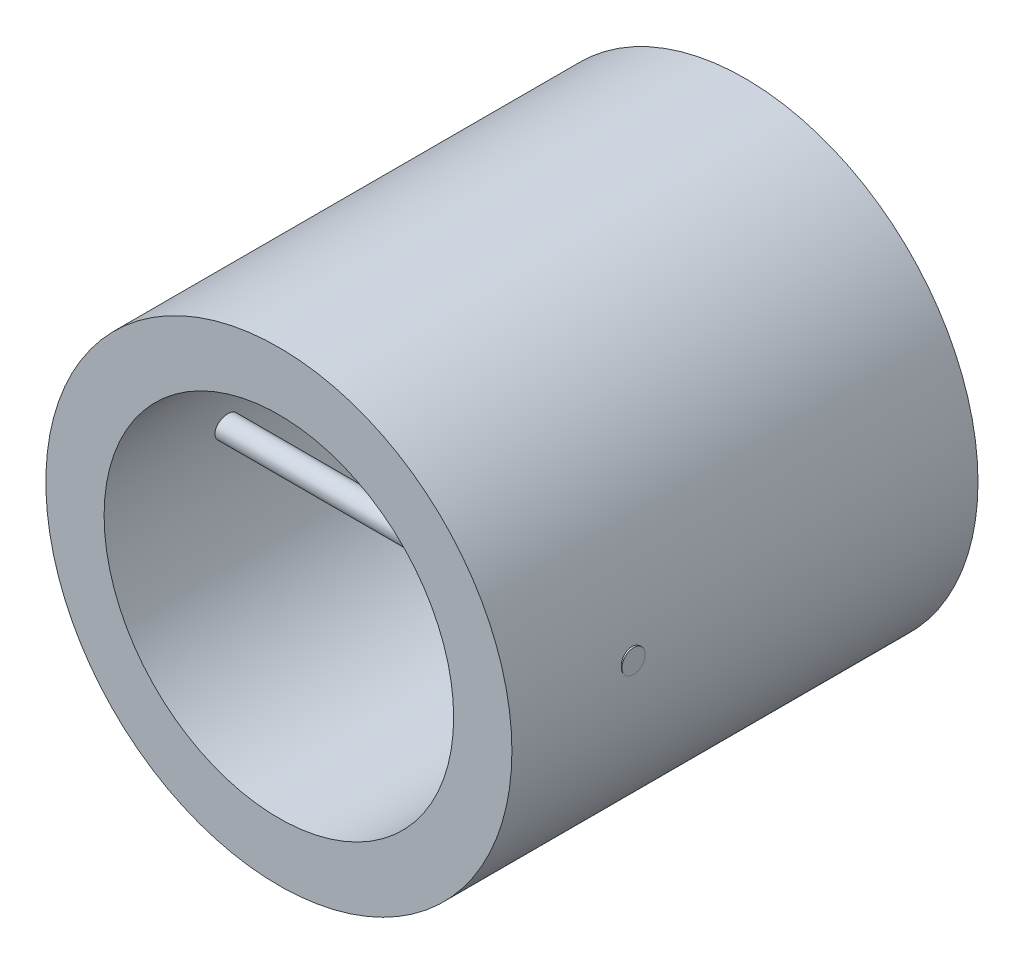
ISO-10303-21;
HEADER;
FILE_DESCRIPTION(('STEP AP214'),'2;1');
FILE_NAME('part.step','',(''),(''),'','','');
FILE_SCHEMA(('AUTOMOTIVE_DESIGN { 1 0 10303 214 1 1 1 1 }'));
ENDSEC;
DATA;
#1=APPLICATION_CONTEXT('core data for automotive mechanical design processes');
#2=APPLICATION_PROTOCOL_DEFINITION('international standard','automotive_design',2000,#1);
#3=PRODUCT_CONTEXT('',#1,'mechanical');
#4=PRODUCT('Part','Part','',(#3));
#5=PRODUCT_RELATED_PRODUCT_CATEGORY('part','',(#4));
#6=PRODUCT_DEFINITION_FORMATION('','',#4);
#7=PRODUCT_DEFINITION_CONTEXT('part definition',#1,'design');
#8=PRODUCT_DEFINITION('design','',#6,#7);
#9=PRODUCT_DEFINITION_SHAPE('','',#8);
#10=(LENGTH_UNIT() NAMED_UNIT(*) SI_UNIT(.MILLI.,.METRE.));
#11=(NAMED_UNIT(*) PLANE_ANGLE_UNIT() SI_UNIT($,.RADIAN.));
#12=(NAMED_UNIT(*) SI_UNIT($,.STERADIAN.) SOLID_ANGLE_UNIT());
#13=UNCERTAINTY_MEASURE_WITH_UNIT(LENGTH_MEASURE(1.E-05),#10,'distance_accuracy_value','');
#14=(GEOMETRIC_REPRESENTATION_CONTEXT(3) GLOBAL_UNCERTAINTY_ASSIGNED_CONTEXT((#13)) GLOBAL_UNIT_ASSIGNED_CONTEXT((#10,
#11,#12)) REPRESENTATION_CONTEXT('',''));
#15=CARTESIAN_POINT('',(0.,0.,0.));
#16=DIRECTION('',(0.,0.,1.));
#17=DIRECTION('',(1.,0.,0.));
#18=AXIS2_PLACEMENT_3D('',#15,#16,#17);
#19=CARTESIAN_POINT('',(0.,0.,-20.));
#20=DIRECTION('',(0.,0.,1.));
#21=DIRECTION('',(1.,0.,0.));
#22=AXIS2_PLACEMENT_3D('',#19,#20,#21);
#23=CYLINDRICAL_SURFACE('',#22,20.);
#24=CARTESIAN_POINT('',(-19.9465515347339,1.46119193544392,10.5588854534509));
#25=CARTESIAN_POINT('',(-19.9506619454008,1.4050766842799,10.5588830165754));
#26=CARTESIAN_POINT('',(-19.9545365537507,1.34890495652887,10.5541465271091));
#27=CARTESIAN_POINT('',(-19.9617200771043,1.23807331930656,10.5352995807464));
#28=CARTESIAN_POINT('',(-19.9650283446956,1.18341519913556,10.5211784846462));
#29=CARTESIAN_POINT('',(-19.9710389955557,1.07723191949604,10.4839462502608));
#30=CARTESIAN_POINT('',(-19.973741591046,1.02570566727827,10.4608382686794));
#31=CARTESIAN_POINT('',(-19.9785539700852,0.927261151305984,10.4062841119598));
#32=CARTESIAN_POINT('',(-19.9806638943725,0.880341795301941,10.3748399198281));
#33=CARTESIAN_POINT('',(-19.9843402566161,0.792513011556447,10.3045574234109));
#34=CARTESIAN_POINT('',(-19.9859075611722,0.751594061589184,10.265731064039));
#35=CARTESIAN_POINT('',(-19.9885787978779,0.676845763661389,10.1817507845756));
#36=CARTESIAN_POINT('',(-19.9896827145537,0.643016652467685,10.1365966532507));
#37=CARTESIAN_POINT('',(-19.9915105715711,0.583434901213421,10.0412749925837));
#38=CARTESIAN_POINT('',(-19.9922347515128,0.557677172542575,9.99111064835176));
#39=CARTESIAN_POINT('',(-19.9933812466742,0.514942633891496,9.88716857925103));
#40=CARTESIAN_POINT('',(-19.9938035622836,0.497965812573834,9.83339085904779));
#41=CARTESIAN_POINT('',(-19.9944033709984,0.473273736454219,9.72373848395316));
#42=CARTESIAN_POINT('',(-19.9945808214333,0.465560095893822,9.66786346532661));
#43=CARTESIAN_POINT('',(-19.9947182916794,0.459619047251709,9.55561115713792));
#44=CARTESIAN_POINT('',(-19.9946783116342,0.46139163290258,9.49923386790766));
#45=CARTESIAN_POINT('',(-19.9943744847288,0.474373534997462,9.38756922955763));
#46=CARTESIAN_POINT('',(-19.9941106073618,0.485584137400545,9.3322820300166));
#47=CARTESIAN_POINT('',(-19.9933195990725,0.517124938020043,9.2243750919469));
#48=CARTESIAN_POINT('',(-19.9927924679505,0.537455143157896,9.17175535544275));
#49=CARTESIAN_POINT('',(-19.9914091218533,0.586654827576998,9.07068076976584));
#50=CARTESIAN_POINT('',(-19.9905529269851,0.615523785083075,9.02222566633942));
#51=CARTESIAN_POINT('',(-19.9884300819366,0.68097826876219,8.93085287044461));
#52=CARTESIAN_POINT('',(-19.9871634331897,0.717563767985105,8.88793515863766));
#53=CARTESIAN_POINT('',(-19.9841374080744,0.797397967138272,8.80886321794997));
#54=CARTESIAN_POINT('',(-19.982378137207,0.840645239476871,8.7727075436582));
#55=CARTESIAN_POINT('',(-19.9782987679457,0.932572537246193,8.70817079254074));
#56=CARTESIAN_POINT('',(-19.975978671187,0.981252546836091,8.67978969304671));
#57=CARTESIAN_POINT('',(-19.970739012161,1.08266274357957,8.63159484974914));
#58=CARTESIAN_POINT('',(-19.9678193537935,1.13539357916724,8.61178248096055));
#59=CARTESIAN_POINT('',(-19.9613850255148,1.24339553207687,8.58127942526351));
#60=CARTESIAN_POINT('',(-19.9578703515743,1.29866666659903,8.57058880012738));
#61=CARTESIAN_POINT('',(-19.9502946746519,1.4102748693819,8.55860412779387));
#62=CARTESIAN_POINT('',(-19.9462327699023,1.46661356228753,8.55732578858436));
#63=CARTESIAN_POINT('',(-19.9376764375796,1.57867564062663,8.56422512057954));
#64=CARTESIAN_POINT('',(-19.9331820008858,1.63439901305751,8.57240299122239));
#65=CARTESIAN_POINT('',(-19.923905751495,1.74384845303163,8.59801370622493));
#66=CARTESIAN_POINT('',(-19.9191230343683,1.79756727641313,8.6154771826987));
#67=CARTESIAN_POINT('',(-19.9094893411738,1.90130231300925,8.65917953107272));
#68=CARTESIAN_POINT('',(-19.9046383636652,1.95131844792384,8.6854185884838));
#69=CARTESIAN_POINT('',(-19.8950922585191,2.04636118309854,8.74601337038325));
#70=CARTESIAN_POINT('',(-19.8903975513616,2.09137498130634,8.78038924634217));
#71=CARTESIAN_POINT('',(-19.8814284427883,2.17498846933629,8.85626083861334));
#72=CARTESIAN_POINT('',(-19.8771540397907,2.21358818329843,8.8977565281283));
#73=CARTESIAN_POINT('',(-19.8692783439921,2.28320097696869,8.98662555329525));
#74=CARTESIAN_POINT('',(-19.8656758834042,2.31422724829828,9.03398844913109));
#75=CARTESIAN_POINT('',(-19.8593531353769,2.36787371822895,9.13331113082876));
#76=CARTESIAN_POINT('',(-19.8566328147005,2.39049423354483,9.18527074340265));
#77=CARTESIAN_POINT('',(-19.8522593566153,2.42654661231349,9.29197298543298));
#78=CARTESIAN_POINT('',(-19.8505997889615,2.44003387145038,9.3466966334978));
#79=CARTESIAN_POINT('',(-19.8484279067266,2.45763904768864,9.45765255131053));
#80=CARTESIAN_POINT('',(-19.8479155498389,2.46175731029779,9.5138847653485));
#81=CARTESIAN_POINT('',(-19.8480707931089,2.46050520446628,9.62592042785481));
#82=CARTESIAN_POINT('',(-19.8487316978564,2.45518867726314,9.68172449577131));
#83=CARTESIAN_POINT('',(-19.8511780036104,2.43532966951467,9.7916398374105));
#84=CARTESIAN_POINT('',(-19.8529634009289,2.42078721922686,9.84575111668429));
#85=CARTESIAN_POINT('',(-19.8575458179143,2.38290485876868,9.9507534860569));
#86=CARTESIAN_POINT('',(-19.8603428321724,2.35956499563564,10.0016445933714));
#87=CARTESIAN_POINT('',(-19.8667766688428,2.30476519820675,10.0987875002795));
#88=CARTESIAN_POINT('',(-19.870413484349,2.27330533068534,10.1450393380196));
#89=CARTESIAN_POINT('',(-19.8783348318486,2.20296625347754,10.2318713826887));
#90=CARTESIAN_POINT('',(-19.8826228338342,2.16404698461762,10.2724188178245));
#91=CARTESIAN_POINT('',(-19.8915916399326,2.07999153933606,10.3464280292331));
#92=CARTESIAN_POINT('',(-19.8962725525546,2.03485364331015,10.3798878390854));
#93=CARTESIAN_POINT('',(-19.9058120209463,1.93932094803563,10.4389816638587));
#94=CARTESIAN_POINT('',(-19.9106715469772,1.88889335032583,10.4645624484229));
#95=CARTESIAN_POINT('',(-19.9202998762838,1.78448595291054,10.5068551001982));
#96=CARTESIAN_POINT('',(-19.9250687778475,1.73051032261434,10.5235771753089));
#97=CARTESIAN_POINT('',(-19.9326471902087,1.64037452545924,10.5433613849527));
#98=CARTESIAN_POINT('',(-19.9355436327302,1.60480173323676,10.5491743543593));
#99=CARTESIAN_POINT('',(-19.9411762950443,1.53322436638089,10.5569371745659));
#100=CARTESIAN_POINT('',(-19.9439125145316,1.49721979092499,10.5588870180059));
#101=CARTESIAN_POINT('',(-19.9465515347339,1.46119193544392,10.5588854534509));
#102=B_SPLINE_CURVE_WITH_KNOTS('',3,(#24,#25,#26,#27,#28,#29,#30,#31,#32,#33,#34,#35,#36,#37,
#38,#39,#40,#41,#42,#43,#44,#45,#46,#47,#48,#49,#50,#51,#52,#53,#54,#55,#56,#57,#58,#59,#60,#61,
#62,#63,#64,#65,#66,#67,#68,#69,#70,#71,#72,#73,#74,#75,#76,#77,#78,#79,#80,#81,#82,#83,#84,#85,
#86,#87,#88,#89,#90,#91,#92,#93,#94,#95,#96,#97,#98,#99,#100,#101),.UNSPECIFIED.,.T.,.F.,(4,2,2,
2,2,2,2,2,2,2,2,2,2,2,2,2,2,2,2,2,2,2,2,2,2,2,2,2,2,2,2,2,2,2,2,2,2,2,4),(0.,0.168665581104644,
0.337522703070151,0.506320566335337,0.675078312167977,0.843565283718895,1.01205788103543,
1.18044403732479,1.34882997620257,1.5172452544791,1.68566042148606,1.85409853929669,
2.02253678494581,2.19096474001148,2.35939210685003,2.5277834304532,2.69617426307229,
2.86459210716925,3.03301109178028,3.20171108411023,3.37041463450729,3.53967820260071,
3.70894534905644,3.87863616780479,4.04832634789135,4.21771881357034,4.38710489617766,
4.55545417682229,4.72379724901846,4.89118272976934,5.05856766156247,5.22595169840742,
5.39333435882202,5.56164246267165,5.7299972016426,5.89946557832908,6.06873824932939,
6.17702694941225,6.28531585580788),.UNSPECIFIED.);
#103=CARTESIAN_POINT('',(-19.9465515347339,1.46119193544392,10.5588854534509));
#104=VERTEX_POINT('',#103);
#105=EDGE_CURVE('E80',#104,#104,#102,.T.);
#106=ORIENTED_EDGE('',*,*,#105,.T.);
#107=EDGE_LOOP('',(#106));
#108=FACE_BOUND('',#107,.T.);
#109=CARTESIAN_POINT('',(0.,0.,-20.));
#110=DIRECTION('',(0.,0.,1.));
#111=DIRECTION('',(1.,0.,0.));
#112=AXIS2_PLACEMENT_3D('',#109,#110,#111);
#113=CIRCLE('',#112,20.);
#114=CARTESIAN_POINT('',(20.,0.,-20.));
#115=VERTEX_POINT('',#114);
#116=EDGE_CURVE('E51',#115,#115,#113,.T.);
#117=ORIENTED_EDGE('',*,*,#116,.T.);
#118=EDGE_LOOP('',(#117));
#119=FACE_BOUND('',#118,.T.);
#120=CARTESIAN_POINT('',(0.,0.,20.));
#121=DIRECTION('',(0.,0.,1.));
#122=DIRECTION('',(1.,0.,0.));
#123=AXIS2_PLACEMENT_3D('',#120,#121,#122);
#124=CIRCLE('',#123,20.);
#125=CARTESIAN_POINT('',(20.,0.,20.));
#126=VERTEX_POINT('',#125);
#127=EDGE_CURVE('E97',#126,#126,#124,.T.);
#128=ORIENTED_EDGE('',*,*,#127,.F.);
#129=EDGE_LOOP('',(#128));
#130=FACE_BOUND('',#129,.T.);
#131=CARTESIAN_POINT('',(19.9465515347339,1.46119193544392,10.5588854534509));
#132=CARTESIAN_POINT('',(19.9424215131454,1.51756565999967,10.5588829627177));
#133=CARTESIAN_POINT('',(19.9380476372395,1.57396242114039,10.5541025562396));
#134=CARTESIAN_POINT('',(19.9289572840547,1.68516608636732,10.5351152972267));
#135=CARTESIAN_POINT('',(19.9242403946397,1.73997096338645,10.5208969324661));
#136=CARTESIAN_POINT('',(19.9146623891275,1.8463676968716,10.4834486589411));
#137=CARTESIAN_POINT('',(19.9098013546762,1.8979613227866,10.4602237648523));
#138=CARTESIAN_POINT('',(19.9001622768126,1.9964957199662,10.4054240680568));
#139=CARTESIAN_POINT('',(19.8953842134354,2.04343762371206,10.3738513045739));
#140=CARTESIAN_POINT('',(19.886153061483,2.13140273890986,10.3031991600586));
#141=CARTESIAN_POINT('',(19.8817003101653,2.17241984986541,10.2641121370693));
#142=CARTESIAN_POINT('',(19.8733754018801,2.24730357288132,10.1795449890972));
#143=CARTESIAN_POINT('',(19.8695032588316,2.28117001352593,10.1340647108989));
#144=CARTESIAN_POINT('',(19.862582818818,2.34066251315832,10.0381607015149));
#145=CARTESIAN_POINT('',(19.8595317405092,2.3663164493399,9.98775446874156));
#146=CARTESIAN_POINT('',(19.8544255176074,2.40878552909334,9.8832996611274));
#147=CARTESIAN_POINT('',(19.8523703293431,2.42560106024595,9.82925124612039));
#148=CARTESIAN_POINT('',(19.8493974961035,2.44980984763294,9.71943210245739));
#149=CARTESIAN_POINT('',(19.8484723649826,2.45726512084882,9.66367524454637));
#150=CARTESIAN_POINT('',(19.8477943274435,2.46273596552048,9.55169412764084));
#151=CARTESIAN_POINT('',(19.848041383069,2.46075184263015,9.49546988383945));
#152=CARTESIAN_POINT('',(19.8496880840853,2.44743266523838,9.38440212526531));
#153=CARTESIAN_POINT('',(19.8510828155368,2.43613747703487,9.32955374937227));
#154=CARTESIAN_POINT('',(19.8549298422451,2.40458135644365,9.22253971295153));
#155=CARTESIAN_POINT('',(19.8573821468081,2.38432034516059,9.17037407603527));
#156=CARTESIAN_POINT('',(19.8631983809318,2.33537059060593,9.07007857115747));
#157=CARTESIAN_POINT('',(19.8665642318001,2.30666407452679,9.0219574919876));
#158=CARTESIAN_POINT('',(19.8740033545335,2.24166396098732,8.93120808539756));
#159=CARTESIAN_POINT('',(19.8780766514423,2.20537009492489,8.88857995252125));
#160=CARTESIAN_POINT('',(19.8867263796979,2.12596225344342,8.80973179090466));
#161=CARTESIAN_POINT('',(19.8913058969164,2.08280565564946,8.77355502410482));
#162=CARTESIAN_POINT('',(19.9006986468477,1.9910591420776,8.70895086600609));
#163=CARTESIAN_POINT('',(19.9055118869313,1.94246905488418,8.68052371928925));
#164=CARTESIAN_POINT('',(19.9151575105533,1.84095383604226,8.63208462255368));
#165=CARTESIAN_POINT('',(19.9199898661959,1.78800781663877,8.61211642661418));
#166=CARTESIAN_POINT('',(19.9294323635215,1.6794909876885,8.58137547002366));
#167=CARTESIAN_POINT('',(19.9340425043237,1.62392016774048,8.57060274581461));
#168=CARTESIAN_POINT('',(19.9428658115035,1.51171105592774,8.55856926570932));
#169=CARTESIAN_POINT('',(19.9470788725415,1.45507248555957,8.55731102689394));
#170=CARTESIAN_POINT('',(19.9549810350418,1.34235760858922,8.56436705809683));
#171=CARTESIAN_POINT('',(19.9586701451746,1.28628129269691,8.57268116968732));
#172=CARTESIAN_POINT('',(19.9654433888407,1.1764729664424,8.59862097276451));
#173=CARTESIAN_POINT('',(19.9685293764109,1.12273417941964,8.61621749223268));
#174=CARTESIAN_POINT('',(19.9740939160225,1.01895779644117,8.66021689869922));
#175=CARTESIAN_POINT('',(19.9765724780122,0.968920139879481,8.68661964145673));
#176=CARTESIAN_POINT('',(19.9809446758823,0.874127036467802,8.74739584168316));
#177=CARTESIAN_POINT('',(19.9828400185041,0.829356418250767,8.78174551617164));
#178=CARTESIAN_POINT('',(19.986117868307,0.746208700860536,8.85748582417677));
#179=CARTESIAN_POINT('',(19.987500378538,0.707831563663657,8.8988764158163));
#180=CARTESIAN_POINT('',(19.9898319680273,0.638607608891307,8.98747323434959));
#181=CARTESIAN_POINT('',(19.9907815253065,0.607752503888329,9.03467297388817));
#182=CARTESIAN_POINT('',(19.9923325129868,0.554397144194585,9.13358464671038));
#183=CARTESIAN_POINT('',(19.9929339437765,0.531896880174795,9.18529657495564));
#184=CARTESIAN_POINT('',(19.9938595335276,0.495890745591106,9.2917676377558));
#185=CARTESIAN_POINT('',(19.9941836777263,0.482385353922169,9.34652693438715));
#186=CARTESIAN_POINT('',(19.9946013177639,0.464754862350147,9.45753629823623));
#187=CARTESIAN_POINT('',(19.9946948129407,0.460629789373706,9.51378636973284));
#188=CARTESIAN_POINT('',(19.9946660288918,0.461877371402821,9.62619139330314));
#189=CARTESIAN_POINT('',(19.9945437100921,0.467251768329399,9.68234632604115));
#190=CARTESIAN_POINT('',(19.9940638870556,0.487348904938497,9.79295679921951));
#191=CARTESIAN_POINT('',(19.9937063822771,0.502071666158299,9.84741233574439));
#192=CARTESIAN_POINT('',(19.992705744135,0.540447041889859,9.95307884296948));
#193=CARTESIAN_POINT('',(19.992062605145,0.56409983230511,10.0042897497338));
#194=CARTESIAN_POINT('',(19.9904174513677,0.619660505021321,10.1020094615463));
#195=CARTESIAN_POINT('',(19.9894154511346,0.651568052520774,10.148518457191));
#196=CARTESIAN_POINT('',(19.9869693185572,0.722717488307019,10.2355034361416));
#197=CARTESIAN_POINT('',(19.9855253142221,0.761957251822605,10.2759811611308));
#198=CARTESIAN_POINT('',(19.9821156319872,0.846668619276031,10.3497817609766));
#199=CARTESIAN_POINT('',(19.9801498292823,0.892141712858523,10.3831029206526));
#200=CARTESIAN_POINT('',(19.9756379184686,0.988024624422905,10.4416485410021));
#201=CARTESIAN_POINT('',(19.9730915759753,1.03843643163906,10.4668697214907));
#202=CARTESIAN_POINT('',(19.9673969033354,1.14270548507529,10.5084695899335));
#203=CARTESIAN_POINT('',(19.9642492845552,1.19655861028467,10.5248586404381));
#204=CARTESIAN_POINT('',(19.9586538665258,1.28582123675894,10.5440207604476));
#205=CARTESIAN_POINT('',(19.9563792441029,1.32066659969748,10.5495891683359));
#206=CARTESIAN_POINT('',(19.9516186760756,1.39073562112469,10.5570222910828));
#207=CARTESIAN_POINT('',(19.9491327307096,1.42595927918668,10.5588870101184));
#208=CARTESIAN_POINT('',(19.9465515347339,1.46119193544392,10.5588854534509));
#209=B_SPLINE_CURVE_WITH_KNOTS('',3,(#131,#132,#133,#134,#135,#136,#137,#138,#139,#140,#141,
#142,#143,#144,#145,#146,#147,#148,#149,#150,#151,#152,#153,#154,#155,#156,#157,#158,#159,#160,
#161,#162,#163,#164,#165,#166,#167,#168,#169,#170,#171,#172,#173,#174,#175,#176,#177,#178,#179,
#180,#181,#182,#183,#184,#185,#186,#187,#188,#189,#190,#191,#192,#193,#194,#195,#196,#197,#198,
#199,#200,#201,#202,#203,#204,#205,#206,#207,#208),.UNSPECIFIED.,.T.,.F.,(4,2,2,2,2,2,2,2,2,2,2,
2,2,2,2,2,2,2,2,2,2,2,2,2,2,2,2,2,2,2,2,2,2,2,2,2,2,2,4),(0.,0.169445168015051,
0.339097402476531,0.508655312894866,0.678171841788386,0.847861688803674,1.01755560315961,
1.18666723175075,1.35577144385882,1.52374922899789,1.69172157494217,1.85897844256907,
2.0262367820127,2.19384965052406,2.36146845375476,2.53017216138356,2.69888119277301,
2.86845252365345,3.03802452654762,3.20764138856941,3.37725544337728,3.54633959666309,
3.71542098058425,3.88400275046553,4.0525835177117,4.22097770243689,4.38937169913243,
4.55777466055683,4.72617810538922,4.89461243362219,5.06304714990496,5.23148518418369,
5.39991638791992,5.56829885818816,5.73672163897528,5.90521253885665,6.07350531915311,
6.17940589853045,6.28530635847294),.UNSPECIFIED.);
#210=CARTESIAN_POINT('',(19.9465515347339,1.46119193544392,10.5588854534509));
#211=VERTEX_POINT('',#210);
#212=EDGE_CURVE('E86',#211,#211,#209,.T.);
#213=ORIENTED_EDGE('',*,*,#212,.T.);
#214=EDGE_LOOP('',(#213));
#215=FACE_BOUND('',#214,.T.);
#216=ADVANCED_FACE('F35',(#108,#119,#130,#215),#23,.T.);
#217=CARTESIAN_POINT('',(0.,0.,-20.));
#218=DIRECTION('',(0.,0.,1.));
#219=DIRECTION('',(1.,0.,0.));
#220=AXIS2_PLACEMENT_3D('',#217,#218,#219);
#221=CYLINDRICAL_SURFACE('',#220,15.);
#222=CARTESIAN_POINT('',(0.,0.,-20.));
#223=DIRECTION('',(0.,0.,1.));
#224=DIRECTION('',(1.,0.,0.));
#225=AXIS2_PLACEMENT_3D('',#222,#223,#224);
#226=CIRCLE('',#225,15.);
#227=CARTESIAN_POINT('',(15.,0.,-20.));
#228=VERTEX_POINT('',#227);
#229=EDGE_CURVE('E55',#228,#228,#226,.T.);
#230=ORIENTED_EDGE('',*,*,#229,.F.);
#231=EDGE_LOOP('',(#230));
#232=FACE_BOUND('',#231,.T.);
#233=CARTESIAN_POINT('',(0.,0.,20.));
#234=DIRECTION('',(0.,0.,1.));
#235=DIRECTION('',(1.,0.,0.));
#236=AXIS2_PLACEMENT_3D('',#233,#234,#235);
#237=CIRCLE('',#236,15.);
#238=CARTESIAN_POINT('',(15.,0.,20.));
#239=VERTEX_POINT('',#238);
#240=EDGE_CURVE('E94',#239,#239,#237,.T.);
#241=ORIENTED_EDGE('',*,*,#240,.T.);
#242=EDGE_LOOP('',(#241));
#243=FACE_BOUND('',#242,.T.);
#244=CARTESIAN_POINT('',(-14.9286609623165,1.46119193544392,10.5588854534509));
#245=CARTESIAN_POINT('',(-14.9341487619743,1.40511988771835,10.5588830616441));
#246=CARTESIAN_POINT('',(-14.9393218677506,1.34897902853967,10.5541540586147));
#247=CARTESIAN_POINT('',(-14.9489133467687,1.2381807616359,10.5353229181264));
#248=CARTESIAN_POINT('',(-14.9533308970874,1.18352502524693,10.5212106414611));
#249=CARTESIAN_POINT('',(-14.9613576741568,1.07731722609052,10.4839824986726));
#250=CARTESIAN_POINT('',(-14.9649671047725,1.02576438295852,10.4608689073582));
#251=CARTESIAN_POINT('',(-14.9713940200602,0.927254460320727,10.4062823021747));
#252=CARTESIAN_POINT('',(-14.9742116862301,0.88029632916999,10.3748112073377));
#253=CARTESIAN_POINT('',(-14.9791173203884,0.792450339136703,10.3044996092973));
#254=CARTESIAN_POINT('',(-14.9812074067982,0.751545060150581,10.2656810173083));
#255=CARTESIAN_POINT('',(-14.9847696967057,0.676816321461857,10.181712693829));
#256=CARTESIAN_POINT('',(-14.9862418823643,0.642993066234988,10.1365627796005));
#257=CARTESIAN_POINT('',(-14.9886789201057,0.583433808502764,10.0412693854245));
#258=CARTESIAN_POINT('',(-14.9896443327795,0.557688882508226,9.99113149653376));
#259=CARTESIAN_POINT('',(-14.9911729095667,0.514970189457227,9.88724322856219));
#260=CARTESIAN_POINT('',(-14.9917360739813,0.497996415834483,9.83349285218581));
#261=CARTESIAN_POINT('',(-14.9925362015182,0.473299682039258,9.72388754312548));
#262=CARTESIAN_POINT('',(-14.9927730639919,0.465579576282795,9.66803196654198));
#263=CARTESIAN_POINT('',(-14.9929569896047,0.459619406476624,9.55581684867005));
#264=CARTESIAN_POINT('',(-14.9929040526768,0.461379344620421,9.49945730726502));
#265=CARTESIAN_POINT('',(-14.992499839166,0.47433078284329,9.38781970087062));
#266=CARTESIAN_POINT('',(-14.992148490351,0.485524566428697,9.3325419010369));
#267=CARTESIAN_POINT('',(-14.9910949731478,0.517027882538163,9.22465134719048));
#268=CARTESIAN_POINT('',(-14.9903928045732,0.537337419907253,9.17203859459426));
#269=CARTESIAN_POINT('',(-14.9885500029784,0.586490032246134,9.07097817046523));
#270=CARTESIAN_POINT('',(-14.9874094173782,0.615332184236352,9.02253004917216));
#271=CARTESIAN_POINT('',(-14.9845814107907,0.6807256074912,8.93116891654918));
#272=CARTESIAN_POINT('',(-14.9828939930281,0.717276833293147,8.88825587257968));
#273=CARTESIAN_POINT('',(-14.9788631558394,0.797024509063274,8.80919690330021));
#274=CARTESIAN_POINT('',(-14.9765199863096,0.840218424790224,8.77304840886895));
#275=CARTESIAN_POINT('',(-14.9710870886275,0.932020409834766,8.70851762224246));
#276=CARTESIAN_POINT('',(-14.9679973643807,0.980628450827384,8.68013528941983));
#277=CARTESIAN_POINT('',(-14.9610198136945,1.08187748928716,8.63191970836597));
#278=CARTESIAN_POINT('',(-14.9571317620607,1.13451962206927,8.61208887726813));
#279=CARTESIAN_POINT('',(-14.9485639483831,1.24231947107086,8.58152483868529));
#280=CARTESIAN_POINT('',(-14.9438841768571,1.2974772174128,8.57079174016856));
#281=CARTESIAN_POINT('',(-14.9337909307381,1.40890970744262,8.55867704007862));
#282=CARTESIAN_POINT('',(-14.9283753284245,1.46518727076997,8.55732317246078));
#283=CARTESIAN_POINT('',(-14.9169657831538,1.57711677938817,8.56404618399281));
#284=CARTESIAN_POINT('',(-14.9109718188545,1.63276870150756,8.57212341128173));
#285=CARTESIAN_POINT('',(-14.8985809954845,1.74222183625734,8.59753371201093));
#286=CARTESIAN_POINT('',(-14.8921819670492,1.79601018539714,8.61492113957087));
#287=CARTESIAN_POINT('',(-14.8792863901564,1.89988914449073,8.65848704955829));
#288=CARTESIAN_POINT('',(-14.8727898379852,1.9499796131955,8.68466586758137));
#289=CARTESIAN_POINT('',(-14.8599848913647,2.04528095012222,8.74522599562438));
#290=CARTESIAN_POINT('',(-14.8536774784638,2.09046877485904,8.77964379276325));
#291=CARTESIAN_POINT('',(-14.841620856635,2.17441771732171,8.85566743110381));
#292=CARTESIAN_POINT('',(-14.8358716443294,2.21317887393594,8.8972732288071));
#293=CARTESIAN_POINT('',(-14.8252816934973,2.2830398327462,8.98638101416425));
#294=CARTESIAN_POINT('',(-14.8204382393089,2.31416262703685,9.03386464337821));
#295=CARTESIAN_POINT('',(-14.8119366829392,2.36796898912886,9.13349168394832));
#296=CARTESIAN_POINT('',(-14.808278500306,2.39065312973025,9.18563477873058));
#297=CARTESIAN_POINT('',(-14.8024161609231,2.42668655817352,9.29249339019339));
#298=CARTESIAN_POINT('',(-14.80019655642,2.44013511630352,9.34717458190193));
#299=CARTESIAN_POINT('',(-14.7972937356201,2.45767749948614,9.45805628934646));
#300=CARTESIAN_POINT('',(-14.7966104149712,2.46177195991695,9.51425670162681));
#301=CARTESIAN_POINT('',(-14.7968242861888,2.46048591619461,9.62597046782362));
#302=CARTESIAN_POINT('',(-14.7977054410895,2.45520155174522,9.68148498650262));
#303=CARTESIAN_POINT('',(-14.8009595398812,2.43550712385624,9.79082430076144));
#304=CARTESIAN_POINT('',(-14.8033324735747,2.42109712279691,9.84464910788901));
#305=CARTESIAN_POINT('',(-14.8094181122727,2.38358837581126,9.94909560195986));
#306=CARTESIAN_POINT('',(-14.8131307816373,2.36048986101679,9.99971737406843));
#307=CARTESIAN_POINT('',(-14.8216665339321,2.30628504997467,10.0963683590613));
#308=CARTESIAN_POINT('',(-14.8264896334608,2.27517863402612,10.1423975032815));
#309=CARTESIAN_POINT('',(-14.8370153638383,2.20549891841429,10.229056420353));
#310=CARTESIAN_POINT('',(-14.8427262674516,2.16685441225237,10.2696279211107));
#311=CARTESIAN_POINT('',(-14.8546728105145,2.08337946389427,10.3437413154744));
#312=CARTESIAN_POINT('',(-14.8609086063156,2.03854717596142,10.3772811040625));
#313=CARTESIAN_POINT('',(-14.8736513935184,1.94340484221988,10.436755045496));
#314=CARTESIAN_POINT('',(-14.8801606734691,1.89303792292663,10.4625976587474));
#315=CARTESIAN_POINT('',(-14.8930626112713,1.78869743716186,10.5054125102059));
#316=CARTESIAN_POINT('',(-14.8994553912075,1.73472795994712,10.5223946191409));
#317=CARTESIAN_POINT('',(-14.9096903615479,1.6439099585385,10.5427373824228));
#318=CARTESIAN_POINT('',(-14.9136446774246,1.60765312669749,10.5487829138054));
#319=CARTESIAN_POINT('',(-14.9213313874665,1.53467136441202,10.5568577382198));
#320=CARTESIAN_POINT('',(-14.9250637810791,1.49794643280199,10.5588870212491));
#321=CARTESIAN_POINT('',(-14.9286609623165,1.46119193544392,10.5588854534509));
#322=B_SPLINE_CURVE_WITH_KNOTS('',3,(#244,#245,#246,#247,#248,#249,#250,#251,#252,#253,#254,
#255,#256,#257,#258,#259,#260,#261,#262,#263,#264,#265,#266,#267,#268,#269,#270,#271,#272,#273,
#274,#275,#276,#277,#278,#279,#280,#281,#282,#283,#284,#285,#286,#287,#288,#289,#290,#291,#292,
#293,#294,#295,#296,#297,#298,#299,#300,#301,#302,#303,#304,#305,#306,#307,#308,#309,#310,#311,
#312,#313,#314,#315,#316,#317,#318,#319,#320,#321),.UNSPECIFIED.,.T.,.F.,(4,2,2,2,2,2,2,2,2,2,2,
2,2,2,2,2,2,2,2,2,2,2,2,2,2,2,2,2,2,2,2,2,2,2,2,2,2,2,4),(0.,0.168886271478975,
0.337955332222419,0.506981693596415,0.675969277007304,0.844460637987839,1.01295686306464,
1.18126630312312,1.34957561718117,1.51793683511957,1.68629809201364,1.85470011324453,
2.02310222398133,2.19148612518703,2.35986903341094,2.52818786079677,2.69650580763361,
2.86487129941489,3.0332388077685,3.20210395942594,3.37097534476188,3.54084354680663,
3.71071823400323,3.88135961814167,4.05199996967494,4.22212020047053,4.39222888171525,
4.56047923143457,4.728718152389,4.89524245061289,5.06176561053618,5.22828434092336,
5.39480556055196,5.56298343818829,5.73121159000298,5.90136711763138,6.07133268266274,
6.18203515941279,6.29273791186564),.UNSPECIFIED.);
#323=CARTESIAN_POINT('',(-14.9286609623165,1.46119193544392,10.5588854534509));
#324=VERTEX_POINT('',#323);
#325=EDGE_CURVE('E47',#324,#324,#322,.T.);
#326=ORIENTED_EDGE('',*,*,#325,.F.);
#327=EDGE_LOOP('',(#326));
#328=FACE_BOUND('',#327,.T.);
#329=CARTESIAN_POINT('',(14.9286609623165,1.46119193544392,10.5588854534509));
#330=CARTESIAN_POINT('',(14.9231271358585,1.51772501967863,10.558882962724));
#331=CARTESIAN_POINT('',(14.9172656678076,1.57426707636899,10.554075549918));
#332=CARTESIAN_POINT('',(14.905082176052,1.68572818490559,10.534994056575));
#333=CARTESIAN_POINT('',(14.8987595920343,1.74064514425602,10.520708282137));
#334=CARTESIAN_POINT('',(14.8859199518913,1.84723228765115,10.483095053747));
#335=CARTESIAN_POINT('',(14.8794030185617,1.89890446032757,10.4597732018399));
#336=CARTESIAN_POINT('',(14.8664784356287,1.99757298880063,10.4047494621102));
#337=CARTESIAN_POINT('',(14.8600707601607,2.04457046433892,10.3730495877812));
#338=CARTESIAN_POINT('',(14.8476849947842,2.13265924238244,10.302078676095));
#339=CARTESIAN_POINT('',(14.8417076861676,2.17373993229897,10.2627943230599));
#340=CARTESIAN_POINT('',(14.8305340799521,2.24871058486387,10.1777766657623));
#341=CARTESIAN_POINT('',(14.825337791593,2.28260046244347,10.1320432852173));
#342=CARTESIAN_POINT('',(14.8160703364966,2.34199943098327,10.0357089233393));
#343=CARTESIAN_POINT('',(14.8119924827943,2.36755851184766,9.98513942339371));
#344=CARTESIAN_POINT('',(14.805178675088,2.40980191091203,9.8803359653093));
#345=CARTESIAN_POINT('',(14.8024426156031,2.42648692672633,9.82610229559867));
#346=CARTESIAN_POINT('',(14.7985160120045,2.4503202576628,9.71620360569231));
#347=CARTESIAN_POINT('',(14.7973074228843,2.45757994881332,9.66056337371374));
#348=CARTESIAN_POINT('',(14.796455595652,2.46270362124607,9.54884154484733));
#349=CARTESIAN_POINT('',(14.7968122701841,2.46056812686499,9.49275997276464));
#350=CARTESIAN_POINT('',(14.7990585407563,2.44702099259816,9.382193524596));
#351=CARTESIAN_POINT('',(14.8009365327561,2.43567957076691,9.32769978529906));
#352=CARTESIAN_POINT('',(14.8060896689001,2.40415508543771,9.22140383232506));
#353=CARTESIAN_POINT('',(14.8093648347412,2.3839718846339,9.16960166045988));
#354=CARTESIAN_POINT('',(14.8171228667866,2.33526814493807,9.06992782627922));
#355=CARTESIAN_POINT('',(14.8216103660541,2.30671558529671,9.02207218133518));
#356=CARTESIAN_POINT('',(14.8315176520692,2.24213028403636,8.93181670075618));
#357=CARTESIAN_POINT('',(14.8369374969219,2.20609707618288,8.88941720544492));
#358=CARTESIAN_POINT('',(14.8484688635975,2.12710605028679,8.81075381593358));
#359=CARTESIAN_POINT('',(14.8545876656168,2.08407290559077,8.77456662441368));
#360=CARTESIAN_POINT('',(14.8671351998567,1.99259116062437,8.70991397433086));
#361=CARTESIAN_POINT('',(14.8735639493865,1.94414225770788,8.68144894760672));
#362=CARTESIAN_POINT('',(14.8864728148579,1.84270497263126,8.63279670178334));
#363=CARTESIAN_POINT('',(14.8929528652374,1.78967925809321,8.61268725251182));
#364=CARTESIAN_POINT('',(14.9056151097142,1.6809614093436,8.58169745161084));
#365=CARTESIAN_POINT('',(14.9117973016714,1.62526925597981,8.57081716628219));
#366=CARTESIAN_POINT('',(14.9236304470434,1.51276373475714,8.55861386584428));
#367=CARTESIAN_POINT('',(14.9292811521833,1.45594985775002,8.55729529565743));
#368=CARTESIAN_POINT('',(14.9398786193091,1.34285248344378,8.56429736130317));
#369=CARTESIAN_POINT('',(14.944825402361,1.28656897031975,8.57261770860756));
#370=CARTESIAN_POINT('',(14.9538941983374,1.1764710845317,8.59861695198836));
#371=CARTESIAN_POINT('',(14.958020658345,1.12264468918346,8.61624338191929));
#372=CARTESIAN_POINT('',(14.9654600668237,1.01868697386086,8.66034381643007));
#373=CARTESIAN_POINT('',(14.9687730390416,0.968555546055463,8.68681756269189));
#374=CARTESIAN_POINT('',(14.9746085876571,0.873697634330005,8.74770714170816));
#375=CARTESIAN_POINT('',(14.9771352334107,0.82894408459599,8.7820804281505));
#376=CARTESIAN_POINT('',(14.9815044998195,0.745827434323042,8.85787420166421));
#377=CARTESIAN_POINT('',(14.9833471279278,0.707464264156897,8.89929461194277));
#378=CARTESIAN_POINT('',(14.9864529118286,0.63830152776921,8.98791729803532));
#379=CARTESIAN_POINT('',(14.9877171997002,0.607487240319067,9.03510804703605));
#380=CARTESIAN_POINT('',(14.9897821849656,0.55420576821518,9.13399659229604));
#381=CARTESIAN_POINT('',(14.9905828829008,0.531738573811727,9.18569438329082));
#382=CARTESIAN_POINT('',(14.9918150188413,0.495790531403109,9.29213479420077));
#383=CARTESIAN_POINT('',(14.9922464212318,0.482310550146181,9.34687770724332));
#384=CARTESIAN_POINT('',(14.9928019412461,0.464724140160542,9.45785068692636));
#385=CARTESIAN_POINT('',(14.9929260577316,0.460617746157547,9.51408075907546));
#386=CARTESIAN_POINT('',(14.9928867383186,0.461895646799985,9.62645133927986));
#387=CARTESIAN_POINT('',(14.9927232082941,0.467283048086907,9.68259181199851));
#388=CARTESIAN_POINT('',(14.9920825756688,0.487401246366947,9.7931712413276));
#389=CARTESIAN_POINT('',(14.9916054722739,0.502132067018799,9.84761019362919));
#390=CARTESIAN_POINT('',(14.9902704112798,0.540517683895228,9.95324170276611));
#391=CARTESIAN_POINT('',(14.9894124459731,0.564172660716559,10.0044341938788));
#392=CARTESIAN_POINT('',(14.9872180285425,0.619729953527163,10.1021152121365));
#393=CARTESIAN_POINT('',(14.985881596317,0.651631926523868,10.1486039347993));
#394=CARTESIAN_POINT('',(14.9826195937691,0.722753908370332,10.2355405666716));
#395=CARTESIAN_POINT('',(14.9806942789331,0.761970740797501,10.2759910842519));
#396=CARTESIAN_POINT('',(14.9761487261067,0.846617823683136,10.3497393356321));
#397=CARTESIAN_POINT('',(14.9735283267134,0.892049516081146,10.3830354048717));
#398=CARTESIAN_POINT('',(14.9675150692649,0.98782291559318,10.4415365743478));
#399=CARTESIAN_POINT('',(14.9641219428347,1.03816632510915,10.4667388561943));
#400=CARTESIAN_POINT('',(14.9565347415052,1.14227023758564,10.5083188361754));
#401=CARTESIAN_POINT('',(14.9523415963724,1.19602672601251,10.5247066946503));
#402=CARTESIAN_POINT('',(14.9448732337787,1.28529216322411,10.5439307624063));
#403=CARTESIAN_POINT('',(14.9418267620801,1.32024915630096,10.5495337623137));
#404=CARTESIAN_POINT('',(14.9354498369099,1.39053357706068,10.5570118826111));
#405=CARTESIAN_POINT('',(14.9321193839757,1.42586100404237,10.5588870100562));
#406=CARTESIAN_POINT('',(14.9286609623165,1.46119193544392,10.5588854534509));
#407=B_SPLINE_CURVE_WITH_KNOTS('',3,(#329,#330,#331,#332,#333,#334,#335,#336,#337,#338,#339,
#340,#341,#342,#343,#344,#345,#346,#347,#348,#349,#350,#351,#352,#353,#354,#355,#356,#357,#358,
#359,#360,#361,#362,#363,#364,#365,#366,#367,#368,#369,#370,#371,#372,#373,#374,#375,#376,#377,
#378,#379,#380,#381,#382,#383,#384,#385,#386,#387,#388,#389,#390,#391,#392,#393,#394,#395,#396,
#397,#398,#399,#400,#401,#402,#403,#404,#405,#406),.UNSPECIFIED.,.T.,.F.,(4,2,2,2,2,2,2,2,2,2,2,
2,2,2,2,2,2,2,2,2,2,2,2,2,2,2,2,2,2,2,2,2,2,2,2,2,2,2,4),(0.,0.170279710738937,
0.340769895194224,0.511154550524668,0.681498294417898,0.852143867194416,1.02279145863029,
1.1923953548402,1.36198591605655,1.52955367232744,1.69711207691395,1.86340430980507,
2.02969912517477,2.19663867094806,2.3635886244228,2.53247107958857,2.70136297705039,
2.87179341495403,3.04222507719197,3.21273596234846,3.3832417436197,3.55279634838217,
3.72234600303497,3.89100303302848,4.05965822527715,4.2279818536383,4.3963052853907,
4.56464494830833,4.73298523486189,4.90138061740374,5.06977642634598,5.23817564327071,
5.40656785759852,5.57488711839778,5.74324549820403,5.91166243976584,6.0798848296669,
6.18630308450719,6.29272113794676),.UNSPECIFIED.);
#408=CARTESIAN_POINT('',(14.9286609623165,1.46119193544392,10.5588854534509));
#409=VERTEX_POINT('',#408);
#410=EDGE_CURVE('E10',#409,#409,#407,.T.);
#411=ORIENTED_EDGE('',*,*,#410,.F.);
#412=EDGE_LOOP('',(#411));
#413=FACE_BOUND('',#412,.T.);
#414=ADVANCED_FACE('F61',(#232,#243,#328,#413),#221,.F.);
#415=CARTESIAN_POINT('',(0.,0.,-20.));
#416=DIRECTION('',(0.,0.,1.));
#417=DIRECTION('',(1.,0.,0.));
#418=AXIS2_PLACEMENT_3D('',#415,#416,#417);
#419=PLANE('',#418);
#420=ORIENTED_EDGE('',*,*,#229,.T.);
#421=EDGE_LOOP('',(#420));
#422=FACE_BOUND('',#421,.T.);
#423=ORIENTED_EDGE('',*,*,#116,.F.);
#424=EDGE_LOOP('',(#423));
#425=FACE_BOUND('',#424,.T.);
#426=ADVANCED_FACE('F102',(#422,#425),#419,.F.);
#427=CARTESIAN_POINT('',(0.,0.,20.));
#428=DIRECTION('',(0.,0.,1.));
#429=DIRECTION('',(1.,0.,0.));
#430=AXIS2_PLACEMENT_3D('',#427,#428,#429);
#431=PLANE('',#430);
#432=ORIENTED_EDGE('',*,*,#127,.T.);
#433=EDGE_LOOP('',(#432));
#434=FACE_BOUND('',#433,.T.);
#435=ORIENTED_EDGE('',*,*,#240,.F.);
#436=EDGE_LOOP('',(#435));
#437=FACE_BOUND('',#436,.T.);
#438=ADVANCED_FACE('F74',(#434,#437),#431,.T.);
#439=CARTESIAN_POINT('',(20.,1.46119193544392,9.55888545345089));
#440=DIRECTION('',(-1.,0.,0.));
#441=DIRECTION('',(0.,0.,1.));
#442=AXIS2_PLACEMENT_3D('',#439,#440,#441);
#443=CYLINDRICAL_SURFACE('',#442,1.);
#444=ORIENTED_EDGE('',*,*,#325,.T.);
#445=EDGE_LOOP('',(#444));
#446=FACE_BOUND('',#445,.T.);
#447=ORIENTED_EDGE('',*,*,#410,.T.);
#448=EDGE_LOOP('',(#447));
#449=FACE_BOUND('',#448,.T.);
#450=ADVANCED_FACE('F71',(#446,#449),#443,.T.);
#451=CARTESIAN_POINT('',(-20.,1.46119193544392,9.55888545345089));
#452=DIRECTION('',(1.,0.,0.));
#453=DIRECTION('',(0.,0.,-1.));
#454=AXIS2_PLACEMENT_3D('',#451,#452,#453);
#455=PLANE('',#454);
#456=CARTESIAN_POINT('',(-20.,1.46119193544392,9.55888545345089));
#457=DIRECTION('',(1.,0.,0.));
#458=DIRECTION('',(0.,0.,-1.));
#459=AXIS2_PLACEMENT_3D('',#456,#457,#458);
#460=CIRCLE('',#459,1.);
#461=CARTESIAN_POINT('',(-20.,1.46119193544392,8.55888545345089));
#462=VERTEX_POINT('',#461);
#463=EDGE_CURVE('E134',#462,#462,#460,.T.);
#464=ORIENTED_EDGE('',*,*,#463,.F.);
#465=EDGE_LOOP('',(#464));
#466=FACE_BOUND('',#465,.T.);
#467=ADVANCED_FACE('F69',(#466),#455,.F.);
#468=ORIENTED_EDGE('',*,*,#105,.F.);
#469=EDGE_LOOP('',(#468));
#470=FACE_BOUND('',#469,.T.);
#471=ORIENTED_EDGE('',*,*,#463,.T.);
#472=EDGE_LOOP('',(#471));
#473=FACE_BOUND('',#472,.T.);
#474=ADVANCED_FACE('F64',(#470,#473),#443,.T.);
#475=ORIENTED_EDGE('',*,*,#212,.F.);
#476=EDGE_LOOP('',(#475));
#477=FACE_BOUND('',#476,.T.);
#478=CARTESIAN_POINT('',(20.,1.46119193544392,9.55888545345089));
#479=DIRECTION('',(1.,0.,0.));
#480=DIRECTION('',(0.,0.,-1.));
#481=AXIS2_PLACEMENT_3D('',#478,#479,#480);
#482=CIRCLE('',#481,1.);
#483=CARTESIAN_POINT('',(20.,1.46119193544392,8.55888545345089));
#484=VERTEX_POINT('',#483);
#485=EDGE_CURVE('E87',#484,#484,#482,.T.);
#486=ORIENTED_EDGE('',*,*,#485,.F.);
#487=EDGE_LOOP('',(#486));
#488=FACE_BOUND('',#487,.T.);
#489=ADVANCED_FACE('F68',(#477,#488),#443,.T.);
#490=CARTESIAN_POINT('',(20.,1.46119193544392,9.55888545345089));
#491=DIRECTION('',(1.,0.,0.));
#492=DIRECTION('',(0.,0.,-1.));
#493=AXIS2_PLACEMENT_3D('',#490,#491,#492);
#494=PLANE('',#493);
#495=ORIENTED_EDGE('',*,*,#485,.T.);
#496=EDGE_LOOP('',(#495));
#497=FACE_BOUND('',#496,.T.);
#498=ADVANCED_FACE('F72',(#497),#494,.T.);
#499=CLOSED_SHELL('',(#216,#414,#426,#438,#450,#467,#474,#489,#498));
#500=MANIFOLD_SOLID_BREP('B2',#499);
#501=ADVANCED_BREP_SHAPE_REPRESENTATION('',(#18,#500),#14);
#502=SHAPE_DEFINITION_REPRESENTATION(#9,#501);
ENDSEC;
END-ISO-10303-21;
